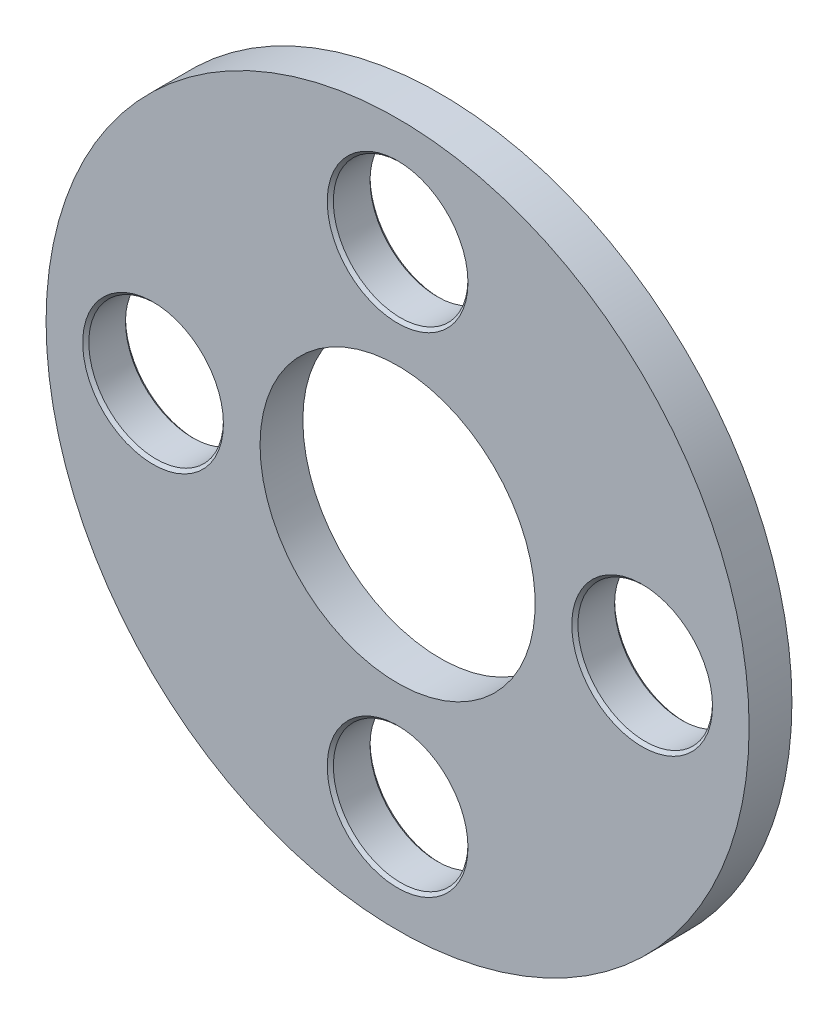
ISO-10303-21;
HEADER;
FILE_DESCRIPTION(('STEP AP214'),'2;1');
FILE_NAME('part.step','',(''),(''),'','','');
FILE_SCHEMA(('AUTOMOTIVE_DESIGN { 1 0 10303 214 1 1 1 1 }'));
ENDSEC;
DATA;
#1=APPLICATION_CONTEXT('core data for automotive mechanical design processes');
#2=APPLICATION_PROTOCOL_DEFINITION('international standard','automotive_design',2000,#1);
#3=PRODUCT_CONTEXT('',#1,'mechanical');
#4=PRODUCT('Part','Part','',(#3));
#5=PRODUCT_RELATED_PRODUCT_CATEGORY('part','',(#4));
#6=PRODUCT_DEFINITION_FORMATION('','',#4);
#7=PRODUCT_DEFINITION_CONTEXT('part definition',#1,'design');
#8=PRODUCT_DEFINITION('design','',#6,#7);
#9=PRODUCT_DEFINITION_SHAPE('','',#8);
#10=(LENGTH_UNIT() NAMED_UNIT(*) SI_UNIT(.MILLI.,.METRE.));
#11=(NAMED_UNIT(*) PLANE_ANGLE_UNIT() SI_UNIT($,.RADIAN.));
#12=(NAMED_UNIT(*) SI_UNIT($,.STERADIAN.) SOLID_ANGLE_UNIT());
#13=UNCERTAINTY_MEASURE_WITH_UNIT(LENGTH_MEASURE(1.E-05),#10,'distance_accuracy_value','');
#14=(GEOMETRIC_REPRESENTATION_CONTEXT(3) GLOBAL_UNCERTAINTY_ASSIGNED_CONTEXT((#13)) GLOBAL_UNIT_ASSIGNED_CONTEXT((#10,
#11,#12)) REPRESENTATION_CONTEXT('',''));
#15=CARTESIAN_POINT('',(0.,0.,0.));
#16=DIRECTION('',(0.,0.,1.));
#17=DIRECTION('',(1.,0.,0.));
#18=AXIS2_PLACEMENT_3D('',#15,#16,#17);
#19=CARTESIAN_POINT('',(0.,0.,-7.));
#20=DIRECTION('',(0.,0.,-1.));
#21=DIRECTION('',(-1.,0.,0.));
#22=AXIS2_PLACEMENT_3D('',#19,#20,#21);
#23=PLANE('',#22);
#24=CARTESIAN_POINT('',(-4.18977760661176E-13,-40.,-7.));
#25=DIRECTION('',(0.,0.,-1.));
#26=DIRECTION('',(-1.,0.,0.));
#27=AXIS2_PLACEMENT_3D('',#24,#25,#26);
#28=CIRCLE('',#27,11.51);
#29=CARTESIAN_POINT('',(-11.5100000000004,-40.,-7.));
#30=VERTEX_POINT('',#29);
#31=EDGE_CURVE('E49',#30,#30,#28,.F.);
#32=ORIENTED_EDGE('',*,*,#31,.T.);
#33=EDGE_LOOP('',(#32));
#34=FACE_BOUND('',#33,.T.);
#35=CARTESIAN_POINT('',(40.,0.,-7.));
#36=DIRECTION('',(0.,0.,-1.));
#37=DIRECTION('',(-1.,0.,0.));
#38=AXIS2_PLACEMENT_3D('',#35,#36,#37);
#39=CIRCLE('',#38,11.51);
#40=CARTESIAN_POINT('',(28.49,0.,-7.));
#41=VERTEX_POINT('',#40);
#42=EDGE_CURVE('E63',#41,#41,#39,.F.);
#43=ORIENTED_EDGE('',*,*,#42,.T.);
#44=EDGE_LOOP('',(#43));
#45=FACE_BOUND('',#44,.T.);
#46=CARTESIAN_POINT('',(1.39659253553725E-13,40.,-7.));
#47=DIRECTION('',(0.,0.,-1.));
#48=DIRECTION('',(-1.,0.,0.));
#49=AXIS2_PLACEMENT_3D('',#46,#47,#48);
#50=CIRCLE('',#49,11.51);
#51=CARTESIAN_POINT('',(-11.5099999999999,40.,-7.));
#52=VERTEX_POINT('',#51);
#53=EDGE_CURVE('E75',#52,#52,#50,.F.);
#54=ORIENTED_EDGE('',*,*,#53,.T.);
#55=EDGE_LOOP('',(#54));
#56=FACE_BOUND('',#55,.T.);
#57=CARTESIAN_POINT('',(-40.,0.,-7.));
#58=DIRECTION('',(0.,0.,-1.));
#59=DIRECTION('',(-1.,0.,0.));
#60=AXIS2_PLACEMENT_3D('',#57,#58,#59);
#61=CIRCLE('',#60,11.51);
#62=CARTESIAN_POINT('',(-51.51,0.,-7.));
#63=VERTEX_POINT('',#62);
#64=EDGE_CURVE('E87',#63,#63,#61,.F.);
#65=ORIENTED_EDGE('',*,*,#64,.T.);
#66=EDGE_LOOP('',(#65));
#67=FACE_BOUND('',#66,.T.);
#68=CARTESIAN_POINT('',(0.,0.,-7.));
#69=DIRECTION('',(0.,0.,-1.));
#70=DIRECTION('',(-1.,0.,0.));
#71=AXIS2_PLACEMENT_3D('',#68,#69,#70);
#72=CIRCLE('',#71,57.5);
#73=CARTESIAN_POINT('',(-57.5,0.,-7.));
#74=VERTEX_POINT('',#73);
#75=EDGE_CURVE('E90',#74,#74,#72,.T.);
#76=ORIENTED_EDGE('',*,*,#75,.T.);
#77=EDGE_LOOP('',(#76));
#78=FACE_BOUND('',#77,.T.);
#79=CARTESIAN_POINT('',(0.,0.,-7.));
#80=DIRECTION('',(0.,0.,-1.));
#81=DIRECTION('',(-1.,0.,0.));
#82=AXIS2_PLACEMENT_3D('',#79,#80,#81);
#83=CIRCLE('',#82,22.5);
#84=CARTESIAN_POINT('',(-22.5,0.,-7.));
#85=VERTEX_POINT('',#84);
#86=EDGE_CURVE('E94',#85,#85,#83,.T.);
#87=ORIENTED_EDGE('',*,*,#86,.F.);
#88=EDGE_LOOP('',(#87));
#89=FACE_BOUND('',#88,.T.);
#90=ADVANCED_FACE('F33',(#34,#45,#56,#67,#78,#89),#23,.T.);
#91=CARTESIAN_POINT('',(0.,0.,0.));
#92=DIRECTION('',(0.,0.,-1.));
#93=DIRECTION('',(-1.,0.,0.));
#94=AXIS2_PLACEMENT_3D('',#91,#92,#93);
#95=PLANE('',#94);
#96=CARTESIAN_POINT('',(-4.18977760661176E-13,-40.,0.));
#97=DIRECTION('',(0.,0.,-1.));
#98=DIRECTION('',(-1.,0.,0.));
#99=AXIS2_PLACEMENT_3D('',#96,#97,#98);
#100=CIRCLE('',#99,11.51);
#101=CARTESIAN_POINT('',(11.5099999999996,-40.,0.));
#102=VERTEX_POINT('',#101);
#103=EDGE_CURVE('E10',#102,#102,#100,.T.);
#104=ORIENTED_EDGE('',*,*,#103,.T.);
#105=EDGE_LOOP('',(#104));
#106=FACE_BOUND('',#105,.T.);
#107=CARTESIAN_POINT('',(40.,0.,0.));
#108=DIRECTION('',(0.,0.,-1.));
#109=DIRECTION('',(-1.,0.,0.));
#110=AXIS2_PLACEMENT_3D('',#107,#108,#109);
#111=CIRCLE('',#110,11.51);
#112=CARTESIAN_POINT('',(51.51,0.,0.));
#113=VERTEX_POINT('',#112);
#114=EDGE_CURVE('E54',#113,#113,#111,.T.);
#115=ORIENTED_EDGE('',*,*,#114,.T.);
#116=EDGE_LOOP('',(#115));
#117=FACE_BOUND('',#116,.T.);
#118=CARTESIAN_POINT('',(1.39659253553725E-13,40.,0.));
#119=DIRECTION('',(0.,0.,-1.));
#120=DIRECTION('',(-1.,0.,0.));
#121=AXIS2_PLACEMENT_3D('',#118,#119,#120);
#122=CIRCLE('',#121,11.51);
#123=CARTESIAN_POINT('',(11.5100000000001,40.,0.));
#124=VERTEX_POINT('',#123);
#125=EDGE_CURVE('E66',#124,#124,#122,.T.);
#126=ORIENTED_EDGE('',*,*,#125,.T.);
#127=EDGE_LOOP('',(#126));
#128=FACE_BOUND('',#127,.T.);
#129=CARTESIAN_POINT('',(-40.,0.,0.));
#130=DIRECTION('',(0.,0.,-1.));
#131=DIRECTION('',(-1.,0.,0.));
#132=AXIS2_PLACEMENT_3D('',#129,#130,#131);
#133=CIRCLE('',#132,11.51);
#134=CARTESIAN_POINT('',(-28.49,0.,0.));
#135=VERTEX_POINT('',#134);
#136=EDGE_CURVE('E78',#135,#135,#133,.T.);
#137=ORIENTED_EDGE('',*,*,#136,.T.);
#138=EDGE_LOOP('',(#137));
#139=FACE_BOUND('',#138,.T.);
#140=CARTESIAN_POINT('',(0.,0.,0.));
#141=DIRECTION('',(0.,0.,-1.));
#142=DIRECTION('',(-1.,0.,0.));
#143=AXIS2_PLACEMENT_3D('',#140,#141,#142);
#144=CIRCLE('',#143,57.5);
#145=CARTESIAN_POINT('',(-57.5,0.,0.));
#146=VERTEX_POINT('',#145);
#147=EDGE_CURVE('E91',#146,#146,#144,.T.);
#148=ORIENTED_EDGE('',*,*,#147,.F.);
#149=EDGE_LOOP('',(#148));
#150=FACE_BOUND('',#149,.T.);
#151=CARTESIAN_POINT('',(0.,0.,0.));
#152=DIRECTION('',(0.,0.,-1.));
#153=DIRECTION('',(-1.,0.,0.));
#154=AXIS2_PLACEMENT_3D('',#151,#152,#153);
#155=CIRCLE('',#154,22.5);
#156=CARTESIAN_POINT('',(-22.5,0.,0.));
#157=VERTEX_POINT('',#156);
#158=EDGE_CURVE('E97',#157,#157,#155,.T.);
#159=ORIENTED_EDGE('',*,*,#158,.T.);
#160=EDGE_LOOP('',(#159));
#161=FACE_BOUND('',#160,.T.);
#162=ADVANCED_FACE('F107',(#106,#117,#128,#139,#150,#161),#95,.F.);
#163=CARTESIAN_POINT('',(0.,0.,-7.));
#164=DIRECTION('',(0.,0.,1.));
#165=DIRECTION('',(1.,0.,0.));
#166=AXIS2_PLACEMENT_3D('',#163,#164,#165);
#167=CYLINDRICAL_SURFACE('',#166,57.5);
#168=ORIENTED_EDGE('',*,*,#75,.F.);
#169=EDGE_LOOP('',(#168));
#170=FACE_BOUND('',#169,.T.);
#171=ORIENTED_EDGE('',*,*,#147,.T.);
#172=EDGE_LOOP('',(#171));
#173=FACE_BOUND('',#172,.T.);
#174=ADVANCED_FACE('F113',(#170,#173),#167,.T.);
#175=CARTESIAN_POINT('',(0.,0.,-7.));
#176=DIRECTION('',(0.,0.,1.));
#177=DIRECTION('',(1.,0.,0.));
#178=AXIS2_PLACEMENT_3D('',#175,#176,#177);
#179=CYLINDRICAL_SURFACE('',#178,22.5);
#180=ORIENTED_EDGE('',*,*,#86,.T.);
#181=EDGE_LOOP('',(#180));
#182=FACE_BOUND('',#181,.T.);
#183=ORIENTED_EDGE('',*,*,#158,.F.);
#184=EDGE_LOOP('',(#183));
#185=FACE_BOUND('',#184,.T.);
#186=ADVANCED_FACE('F103',(#182,#185),#179,.F.);
#187=CARTESIAN_POINT('',(-40.,0.,-7.));
#188=DIRECTION('',(0.,0.,1.));
#189=DIRECTION('',(1.,0.,0.));
#190=AXIS2_PLACEMENT_3D('',#187,#188,#189);
#191=CYLINDRICAL_SURFACE('',#190,11.01);
#192=CARTESIAN_POINT('',(-40.,0.,-6.50000000000001));
#193=DIRECTION('',(0.,0.,-1.));
#194=DIRECTION('',(-1.,0.,0.));
#195=AXIS2_PLACEMENT_3D('',#192,#193,#194);
#196=CIRCLE('',#195,11.01);
#197=CARTESIAN_POINT('',(-51.01,0.,-6.50000000000001));
#198=VERTEX_POINT('',#197);
#199=EDGE_CURVE('E81',#198,#198,#196,.T.);
#200=ORIENTED_EDGE('',*,*,#199,.T.);
#201=EDGE_LOOP('',(#200));
#202=FACE_BOUND('',#201,.T.);
#203=CARTESIAN_POINT('',(-40.,0.,-0.50000000000002));
#204=DIRECTION('',(0.,0.,-1.));
#205=DIRECTION('',(-1.,0.,0.));
#206=AXIS2_PLACEMENT_3D('',#203,#204,#205);
#207=CIRCLE('',#206,11.01);
#208=CARTESIAN_POINT('',(-28.99,0.,-0.500000000000019));
#209=VERTEX_POINT('',#208);
#210=EDGE_CURVE('E84',#209,#209,#207,.F.);
#211=ORIENTED_EDGE('',*,*,#210,.T.);
#212=EDGE_LOOP('',(#211));
#213=FACE_BOUND('',#212,.T.);
#214=ADVANCED_FACE('F130',(#202,#213),#191,.F.);
#215=CARTESIAN_POINT('',(-40.,0.,-7.));
#216=DIRECTION('',(0.,0.,-1.));
#217=DIRECTION('',(-1.,0.,0.));
#218=AXIS2_PLACEMENT_3D('',#215,#216,#217);
#219=CONICAL_SURFACE('',#218,11.51,0.785398163397467);
#220=ORIENTED_EDGE('',*,*,#199,.F.);
#221=EDGE_LOOP('',(#220));
#222=FACE_BOUND('',#221,.T.);
#223=ORIENTED_EDGE('',*,*,#64,.F.);
#224=EDGE_LOOP('',(#223));
#225=FACE_BOUND('',#224,.T.);
#226=ADVANCED_FACE('F123',(#222,#225),#219,.F.);
#227=CARTESIAN_POINT('',(-40.,0.,-0.50000000000002));
#228=DIRECTION('',(0.,0.,1.));
#229=DIRECTION('',(1.,0.,0.));
#230=AXIS2_PLACEMENT_3D('',#227,#228,#229);
#231=CONICAL_SURFACE('',#230,11.01,0.785398163397436);
#232=CARTESIAN_POINT('',(-28.49,0.,0.));
#233=CARTESIAN_POINT('',(-28.4952083333333,0.,-0.00520833333333384));
#234=CARTESIAN_POINT('',(-28.5004166666667,0.,-0.0104166666666673));
#235=CARTESIAN_POINT('',(-28.5108333333333,0.,-0.0208333333333342));
#236=CARTESIAN_POINT('',(-28.5160416666667,0.,-0.0260416666666677));
#237=CARTESIAN_POINT('',(-28.5264583333333,0.,-0.0364583333333344));
#238=CARTESIAN_POINT('',(-28.5316666666667,0.,-0.0416666666666678));
#239=CARTESIAN_POINT('',(-28.5420833333333,0.,-0.052083333333335));
#240=CARTESIAN_POINT('',(-28.5472916666667,0.,-0.0572916666666689));
#241=CARTESIAN_POINT('',(-28.5577083333333,0.,-0.0677083333333362));
#242=CARTESIAN_POINT('',(-28.5629166666667,0.,-0.0729166666666695));
#243=CARTESIAN_POINT('',(-28.5733333333333,0.,-0.0833333333333363));
#244=CARTESIAN_POINT('',(-28.5785416666667,0.,-0.0885416666666697));
#245=CARTESIAN_POINT('',(-28.5889583333333,0.,-0.0989583333333368));
#246=CARTESIAN_POINT('',(-28.5941666666667,0.,-0.10416666666667));
#247=CARTESIAN_POINT('',(-28.6045833333333,0.,-0.114583333333338));
#248=CARTESIAN_POINT('',(-28.6097916666667,0.,-0.119791666666671));
#249=CARTESIAN_POINT('',(-28.6202083333333,0.,-0.130208333333339));
#250=CARTESIAN_POINT('',(-28.6254166666667,0.,-0.135416666666672));
#251=CARTESIAN_POINT('',(-28.6358333333333,0.,-0.145833333333339));
#252=CARTESIAN_POINT('',(-28.6410416666667,0.,-0.151041666666672));
#253=CARTESIAN_POINT('',(-28.6514583333333,0.,-0.161458333333339));
#254=CARTESIAN_POINT('',(-28.6566666666667,0.,-0.166666666666673));
#255=CARTESIAN_POINT('',(-28.6670833333333,0.,-0.17708333333334));
#256=CARTESIAN_POINT('',(-28.6722916666667,0.,-0.182291666666674));
#257=CARTESIAN_POINT('',(-28.6827083333333,0.,-0.192708333333341));
#258=CARTESIAN_POINT('',(-28.6879166666667,0.,-0.197916666666674));
#259=CARTESIAN_POINT('',(-28.6983333333333,0.,-0.208333333333341));
#260=CARTESIAN_POINT('',(-28.7035416666667,0.,-0.213541666666675));
#261=CARTESIAN_POINT('',(-28.7139583333333,0.,-0.223958333333342));
#262=CARTESIAN_POINT('',(-28.7191666666667,0.,-0.229166666666676));
#263=CARTESIAN_POINT('',(-28.7295833333333,0.,-0.239583333333343));
#264=CARTESIAN_POINT('',(-28.7347916666667,0.,-0.244791666666676));
#265=CARTESIAN_POINT('',(-28.7452083333333,0.,-0.255208333333343));
#266=CARTESIAN_POINT('',(-28.7504166666667,0.,-0.260416666666676));
#267=CARTESIAN_POINT('',(-28.7608333333333,0.,-0.270833333333343));
#268=CARTESIAN_POINT('',(-28.7660416666667,0.,-0.276041666666677));
#269=CARTESIAN_POINT('',(-28.7764583333333,0.,-0.286458333333345));
#270=CARTESIAN_POINT('',(-28.7816666666667,0.,-0.291666666666678));
#271=CARTESIAN_POINT('',(-28.7920833333333,0.,-0.302083333333345));
#272=CARTESIAN_POINT('',(-28.7972916666667,0.,-0.307291666666679));
#273=CARTESIAN_POINT('',(-28.8077083333333,0.,-0.317708333333345));
#274=CARTESIAN_POINT('',(-28.8129166666667,0.,-0.322916666666679));
#275=CARTESIAN_POINT('',(-28.8233333333333,0.,-0.333333333333346));
#276=CARTESIAN_POINT('',(-28.8285416666667,0.,-0.33854166666668));
#277=CARTESIAN_POINT('',(-28.8389583333333,0.,-0.348958333333347));
#278=CARTESIAN_POINT('',(-28.8441666666667,0.,-0.354166666666681));
#279=CARTESIAN_POINT('',(-28.8545833333333,0.,-0.364583333333347));
#280=CARTESIAN_POINT('',(-28.8597916666667,0.,-0.369791666666681));
#281=CARTESIAN_POINT('',(-28.8702083333333,0.,-0.380208333333348));
#282=CARTESIAN_POINT('',(-28.8754166666667,0.,-0.385416666666681));
#283=CARTESIAN_POINT('',(-28.8858333333333,0.,-0.395833333333349));
#284=CARTESIAN_POINT('',(-28.8910416666667,0.,-0.401041666666683));
#285=CARTESIAN_POINT('',(-28.9014583333333,0.,-0.41145833333335));
#286=CARTESIAN_POINT('',(-28.9066666666667,0.,-0.416666666666683));
#287=CARTESIAN_POINT('',(-28.9170833333333,0.,-0.42708333333335));
#288=CARTESIAN_POINT('',(-28.9222916666667,0.,-0.432291666666683));
#289=CARTESIAN_POINT('',(-28.9327083333333,0.,-0.44270833333335));
#290=CARTESIAN_POINT('',(-28.9379166666667,0.,-0.447916666666684));
#291=CARTESIAN_POINT('',(-28.9483333333333,0.,-0.458333333333351));
#292=CARTESIAN_POINT('',(-28.9535416666667,0.,-0.463541666666685));
#293=CARTESIAN_POINT('',(-28.9639583333333,0.,-0.473958333333352));
#294=CARTESIAN_POINT('',(-28.9691666666667,0.,-0.479166666666685));
#295=CARTESIAN_POINT('',(-28.9795833333333,0.,-0.489583333333352));
#296=CARTESIAN_POINT('',(-28.9847916666667,0.,-0.494791666666685));
#297=CARTESIAN_POINT('',(-28.99,0.,-0.500000000000019));
#298=B_SPLINE_CURVE_WITH_KNOTS('',3,(#232,#233,#234,#235,#236,#237,#238,#239,#240,#241,#242,
#243,#244,#245,#246,#247,#248,#249,#250,#251,#252,#253,#254,#255,#256,#257,#258,#259,#260,#261,
#262,#263,#264,#265,#266,#267,#268,#269,#270,#271,#272,#273,#274,#275,#276,#277,#278,#279,#280,
#281,#282,#283,#284,#285,#286,#287,#288,#289,#290,#291,#292,#293,#294,#295,#296,#297),
.UNSPECIFIED.,.F.,.F.,(4,2,2,2,2,2,2,2,2,2,2,2,2,2,2,2,2,2,2,2,2,2,2,2,2,2,2,2,2,2,2,2,4),(0.,
0.0220970869120788,0.0441941738241601,0.0662912607362414,0.0883883476483202,0.110485434560401,
0.132582521472483,0.154679608384562,0.17677669529664,0.198873782208722,0.220970869120803,
0.243067956032882,0.265165042944961,0.287262129857044,0.309359216769123,0.331456303681202,
0.353553390593283,0.375650477505365,0.397747564417443,0.419844651329522,0.441941738241603,
0.464038825153685,0.486135912065764,0.508232998977845,0.530330085889926,0.552427172802005,
0.574524259714084,0.596621346626165,0.618718433538246,0.640815520450325,0.662912607362407,
0.685009694274488,0.707106781186567),.UNSPECIFIED.);
#299=EDGE_CURVE('BSEAM129',#135,#209,#298,.T.);
#300=ORIENTED_EDGE('',*,*,#136,.F.);
#301=ORIENTED_EDGE('',*,*,#210,.F.);
#302=ORIENTED_EDGE('',*,*,#299,.T.);
#303=ORIENTED_EDGE('',*,*,#299,.F.);
#304=EDGE_LOOP('',(#300,#302,#301,#303));
#305=FACE_BOUND('',#304,.T.);
#306=ADVANCED_FACE('F129',(#305),#231,.F.);
#307=CARTESIAN_POINT('',(-4.18977760661176E-13,-40.,-7.));
#308=DIRECTION('',(0.,0.,1.));
#309=DIRECTION('',(1.,0.,0.));
#310=AXIS2_PLACEMENT_3D('',#307,#308,#309);
#311=CYLINDRICAL_SURFACE('',#310,11.01);
#312=CARTESIAN_POINT('',(-4.18977760661176E-13,-40.,-6.50000000000001));
#313=DIRECTION('',(0.,0.,-1.));
#314=DIRECTION('',(-1.,0.,0.));
#315=AXIS2_PLACEMENT_3D('',#312,#313,#314);
#316=CIRCLE('',#315,11.01);
#317=CARTESIAN_POINT('',(-11.0100000000004,-40.,-6.50000000000001));
#318=VERTEX_POINT('',#317);
#319=EDGE_CURVE('E41',#318,#318,#316,.T.);
#320=ORIENTED_EDGE('',*,*,#319,.T.);
#321=EDGE_LOOP('',(#320));
#322=FACE_BOUND('',#321,.T.);
#323=CARTESIAN_POINT('',(-4.18977760661176E-13,-40.,-0.50000000000002));
#324=DIRECTION('',(0.,0.,-1.));
#325=DIRECTION('',(-1.,0.,0.));
#326=AXIS2_PLACEMENT_3D('',#323,#324,#325);
#327=CIRCLE('',#326,11.01);
#328=CARTESIAN_POINT('',(11.0099999999996,-40.,-0.500000000000019));
#329=VERTEX_POINT('',#328);
#330=EDGE_CURVE('E45',#329,#329,#327,.F.);
#331=ORIENTED_EDGE('',*,*,#330,.T.);
#332=EDGE_LOOP('',(#331));
#333=FACE_BOUND('',#332,.T.);
#334=ADVANCED_FACE('F137',(#322,#333),#311,.F.);
#335=CARTESIAN_POINT('',(40.,0.,-7.));
#336=DIRECTION('',(0.,0.,1.));
#337=DIRECTION('',(1.,0.,0.));
#338=AXIS2_PLACEMENT_3D('',#335,#336,#337);
#339=CYLINDRICAL_SURFACE('',#338,11.01);
#340=CARTESIAN_POINT('',(40.,0.,-6.50000000000001));
#341=DIRECTION('',(0.,0.,-1.));
#342=DIRECTION('',(-1.,0.,0.));
#343=AXIS2_PLACEMENT_3D('',#340,#341,#342);
#344=CIRCLE('',#343,11.01);
#345=CARTESIAN_POINT('',(28.99,0.,-6.50000000000001));
#346=VERTEX_POINT('',#345);
#347=EDGE_CURVE('E57',#346,#346,#344,.T.);
#348=ORIENTED_EDGE('',*,*,#347,.T.);
#349=EDGE_LOOP('',(#348));
#350=FACE_BOUND('',#349,.T.);
#351=CARTESIAN_POINT('',(40.,0.,-0.50000000000002));
#352=DIRECTION('',(0.,0.,-1.));
#353=DIRECTION('',(-1.,0.,0.));
#354=AXIS2_PLACEMENT_3D('',#351,#352,#353);
#355=CIRCLE('',#354,11.01);
#356=CARTESIAN_POINT('',(51.01,0.,-0.500000000000019));
#357=VERTEX_POINT('',#356);
#358=EDGE_CURVE('E60',#357,#357,#355,.F.);
#359=ORIENTED_EDGE('',*,*,#358,.T.);
#360=EDGE_LOOP('',(#359));
#361=FACE_BOUND('',#360,.T.);
#362=ADVANCED_FACE('F184',(#350,#361),#339,.F.);
#363=CARTESIAN_POINT('',(1.39659253553725E-13,40.,-7.));
#364=DIRECTION('',(0.,0.,1.));
#365=DIRECTION('',(1.,0.,0.));
#366=AXIS2_PLACEMENT_3D('',#363,#364,#365);
#367=CYLINDRICAL_SURFACE('',#366,11.01);
#368=CARTESIAN_POINT('',(1.39659253553725E-13,40.,-6.50000000000001));
#369=DIRECTION('',(0.,0.,-1.));
#370=DIRECTION('',(-1.,0.,0.));
#371=AXIS2_PLACEMENT_3D('',#368,#369,#370);
#372=CIRCLE('',#371,11.01);
#373=CARTESIAN_POINT('',(-11.0099999999999,40.,-6.50000000000001));
#374=VERTEX_POINT('',#373);
#375=EDGE_CURVE('E69',#374,#374,#372,.T.);
#376=ORIENTED_EDGE('',*,*,#375,.T.);
#377=EDGE_LOOP('',(#376));
#378=FACE_BOUND('',#377,.T.);
#379=CARTESIAN_POINT('',(1.39659253553725E-13,40.,-0.50000000000002));
#380=DIRECTION('',(0.,0.,-1.));
#381=DIRECTION('',(-1.,0.,0.));
#382=AXIS2_PLACEMENT_3D('',#379,#380,#381);
#383=CIRCLE('',#382,11.01);
#384=CARTESIAN_POINT('',(11.0100000000001,40.,-0.500000000000019));
#385=VERTEX_POINT('',#384);
#386=EDGE_CURVE('E72',#385,#385,#383,.F.);
#387=ORIENTED_EDGE('',*,*,#386,.T.);
#388=EDGE_LOOP('',(#387));
#389=FACE_BOUND('',#388,.T.);
#390=ADVANCED_FACE('F146',(#378,#389),#367,.F.);
#391=CARTESIAN_POINT('',(1.39659253553725E-13,40.,-7.));
#392=DIRECTION('',(0.,0.,-1.));
#393=DIRECTION('',(-1.,0.,0.));
#394=AXIS2_PLACEMENT_3D('',#391,#392,#393);
#395=CONICAL_SURFACE('',#394,11.51,0.785398163397467);
#396=ORIENTED_EDGE('',*,*,#375,.F.);
#397=EDGE_LOOP('',(#396));
#398=FACE_BOUND('',#397,.T.);
#399=ORIENTED_EDGE('',*,*,#53,.F.);
#400=EDGE_LOOP('',(#399));
#401=FACE_BOUND('',#400,.T.);
#402=ADVANCED_FACE('F139',(#398,#401),#395,.F.);
#403=CARTESIAN_POINT('',(1.39659253553725E-13,40.,-0.50000000000002));
#404=DIRECTION('',(0.,0.,1.));
#405=DIRECTION('',(1.,0.,0.));
#406=AXIS2_PLACEMENT_3D('',#403,#404,#405);
#407=CONICAL_SURFACE('',#406,11.01,0.785398163397436);
#408=CARTESIAN_POINT('',(11.5100000000001,40.,0.));
#409=CARTESIAN_POINT('',(11.5047916666668,40.,-0.00520833333333339));
#410=CARTESIAN_POINT('',(11.4995833333335,40.,-0.0104166666666669));
#411=CARTESIAN_POINT('',(11.4891666666668,40.,-0.020833333333334));
#412=CARTESIAN_POINT('',(11.4839583333335,40.,-0.0260416666666675));
#413=CARTESIAN_POINT('',(11.4735416666668,40.,-0.0364583333333346));
#414=CARTESIAN_POINT('',(11.4683333333335,40.,-0.0416666666666681));
#415=CARTESIAN_POINT('',(11.4579166666668,40.,-0.0520833333333353));
#416=CARTESIAN_POINT('',(11.4527083333335,40.,-0.0572916666666689));
#417=CARTESIAN_POINT('',(11.4422916666668,40.,-0.0677083333333359));
#418=CARTESIAN_POINT('',(11.4370833333335,40.,-0.0729166666666693));
#419=CARTESIAN_POINT('',(11.4266666666668,40.,-0.0833333333333362));
#420=CARTESIAN_POINT('',(11.4214583333335,40.,-0.0885416666666699));
#421=CARTESIAN_POINT('',(11.4110416666668,40.,-0.0989583333333371));
#422=CARTESIAN_POINT('',(11.4058333333335,40.,-0.104166666666671));
#423=CARTESIAN_POINT('',(11.3954166666668,40.,-0.114583333333338));
#424=CARTESIAN_POINT('',(11.3902083333335,40.,-0.119791666666671));
#425=CARTESIAN_POINT('',(11.3797916666668,40.,-0.130208333333338));
#426=CARTESIAN_POINT('',(11.3745833333335,40.,-0.135416666666672));
#427=CARTESIAN_POINT('',(11.3641666666668,40.,-0.145833333333339));
#428=CARTESIAN_POINT('',(11.3589583333335,40.,-0.151041666666672));
#429=CARTESIAN_POINT('',(11.3485416666668,40.,-0.161458333333339));
#430=CARTESIAN_POINT('',(11.3433333333335,40.,-0.166666666666673));
#431=CARTESIAN_POINT('',(11.3329166666668,40.,-0.17708333333334));
#432=CARTESIAN_POINT('',(11.3277083333335,40.,-0.182291666666674));
#433=CARTESIAN_POINT('',(11.3172916666668,40.,-0.192708333333341));
#434=CARTESIAN_POINT('',(11.3120833333335,40.,-0.197916666666674));
#435=CARTESIAN_POINT('',(11.3016666666668,40.,-0.208333333333341));
#436=CARTESIAN_POINT('',(11.2964583333335,40.,-0.213541666666675));
#437=CARTESIAN_POINT('',(11.2860416666668,40.,-0.223958333333342));
#438=CARTESIAN_POINT('',(11.2808333333335,40.,-0.229166666666676));
#439=CARTESIAN_POINT('',(11.2704166666668,40.,-0.239583333333343));
#440=CARTESIAN_POINT('',(11.2652083333335,40.,-0.244791666666676));
#441=CARTESIAN_POINT('',(11.2547916666668,40.,-0.255208333333343));
#442=CARTESIAN_POINT('',(11.2495833333335,40.,-0.260416666666677));
#443=CARTESIAN_POINT('',(11.2391666666668,40.,-0.270833333333344));
#444=CARTESIAN_POINT('',(11.2339583333335,40.,-0.276041666666677));
#445=CARTESIAN_POINT('',(11.2235416666668,40.,-0.286458333333344));
#446=CARTESIAN_POINT('',(11.2183333333335,40.,-0.291666666666678));
#447=CARTESIAN_POINT('',(11.2079166666668,40.,-0.302083333333345));
#448=CARTESIAN_POINT('',(11.2027083333335,40.,-0.307291666666679));
#449=CARTESIAN_POINT('',(11.1922916666668,40.,-0.317708333333346));
#450=CARTESIAN_POINT('',(11.1870833333335,40.,-0.322916666666679));
#451=CARTESIAN_POINT('',(11.1766666666668,40.,-0.333333333333346));
#452=CARTESIAN_POINT('',(11.1714583333335,40.,-0.33854166666668));
#453=CARTESIAN_POINT('',(11.1610416666668,40.,-0.348958333333347));
#454=CARTESIAN_POINT('',(11.1558333333335,40.,-0.35416666666668));
#455=CARTESIAN_POINT('',(11.1454166666668,40.,-0.364583333333347));
#456=CARTESIAN_POINT('',(11.1402083333335,40.,-0.369791666666681));
#457=CARTESIAN_POINT('',(11.1297916666668,40.,-0.380208333333348));
#458=CARTESIAN_POINT('',(11.1245833333335,40.,-0.385416666666682));
#459=CARTESIAN_POINT('',(11.1141666666668,40.,-0.395833333333349));
#460=CARTESIAN_POINT('',(11.1089583333335,40.,-0.401041666666682));
#461=CARTESIAN_POINT('',(11.0985416666668,40.,-0.411458333333349));
#462=CARTESIAN_POINT('',(11.0933333333335,40.,-0.416666666666683));
#463=CARTESIAN_POINT('',(11.0829166666668,40.,-0.42708333333335));
#464=CARTESIAN_POINT('',(11.0777083333335,40.,-0.432291666666684));
#465=CARTESIAN_POINT('',(11.0672916666668,40.,-0.442708333333351));
#466=CARTESIAN_POINT('',(11.0620833333335,40.,-0.447916666666684));
#467=CARTESIAN_POINT('',(11.0516666666668,40.,-0.458333333333351));
#468=CARTESIAN_POINT('',(11.0464583333335,40.,-0.463541666666685));
#469=CARTESIAN_POINT('',(11.0360416666668,40.,-0.473958333333352));
#470=CARTESIAN_POINT('',(11.0308333333335,40.,-0.479166666666685));
#471=CARTESIAN_POINT('',(11.0204166666668,40.,-0.489583333333352));
#472=CARTESIAN_POINT('',(11.0152083333335,40.,-0.494791666666686));
#473=CARTESIAN_POINT('',(11.0100000000001,40.,-0.500000000000019));
#474=B_SPLINE_CURVE_WITH_KNOTS('',3,(#408,#409,#410,#411,#412,#413,#414,#415,#416,#417,#418,
#419,#420,#421,#422,#423,#424,#425,#426,#427,#428,#429,#430,#431,#432,#433,#434,#435,#436,#437,
#438,#439,#440,#441,#442,#443,#444,#445,#446,#447,#448,#449,#450,#451,#452,#453,#454,#455,#456,
#457,#458,#459,#460,#461,#462,#463,#464,#465,#466,#467,#468,#469,#470,#471,#472,#473),
.UNSPECIFIED.,.F.,.F.,(4,2,2,2,2,2,2,2,2,2,2,2,2,2,2,2,2,2,2,2,2,2,2,2,2,2,2,2,2,2,2,2,4),(0.,
0.02209708691208,0.0441941738241601,0.0662912607362401,0.0883883476483202,0.110485434560401,
0.132582521472482,0.154679608384562,0.176776695296642,0.198873782208722,0.220970869120802,
0.243067956032882,0.265165042944962,0.287262129857043,0.309359216769123,0.331456303681203,
0.353553390593283,0.375650477505363,0.397747564417444,0.419844651329524,0.441941738241604,
0.464038825153685,0.486135912065765,0.508232998977845,0.530330085889925,0.552427172802005,
0.574524259714085,0.596621346626165,0.618718433538245,0.640815520450327,0.662912607362407,
0.685009694274487,0.707106781186567),.UNSPECIFIED.);
#475=EDGE_CURVE('BSEAM145',#124,#385,#474,.T.);
#476=ORIENTED_EDGE('',*,*,#125,.F.);
#477=ORIENTED_EDGE('',*,*,#386,.F.);
#478=ORIENTED_EDGE('',*,*,#475,.T.);
#479=ORIENTED_EDGE('',*,*,#475,.F.);
#480=EDGE_LOOP('',(#476,#478,#477,#479));
#481=FACE_BOUND('',#480,.T.);
#482=ADVANCED_FACE('F145',(#481),#407,.F.);
#483=CARTESIAN_POINT('',(40.,0.,-7.));
#484=DIRECTION('',(0.,0.,-1.));
#485=DIRECTION('',(-1.,0.,0.));
#486=AXIS2_PLACEMENT_3D('',#483,#484,#485);
#487=CONICAL_SURFACE('',#486,11.51,0.785398163397467);
#488=ORIENTED_EDGE('',*,*,#347,.F.);
#489=EDGE_LOOP('',(#488));
#490=FACE_BOUND('',#489,.T.);
#491=ORIENTED_EDGE('',*,*,#42,.F.);
#492=EDGE_LOOP('',(#491));
#493=FACE_BOUND('',#492,.T.);
#494=ADVANCED_FACE('F153',(#490,#493),#487,.F.);
#495=CARTESIAN_POINT('',(40.,0.,-0.50000000000002));
#496=DIRECTION('',(0.,0.,1.));
#497=DIRECTION('',(1.,0.,0.));
#498=AXIS2_PLACEMENT_3D('',#495,#496,#497);
#499=CONICAL_SURFACE('',#498,11.01,0.785398163397436);
#500=CARTESIAN_POINT('',(51.51,0.,0.));
#501=CARTESIAN_POINT('',(51.5047916666667,0.,-0.00520833333333503));
#502=CARTESIAN_POINT('',(51.4995833333333,0.,-0.010416666666668));
#503=CARTESIAN_POINT('',(51.4891666666667,0.,-0.020833333333334));
#504=CARTESIAN_POINT('',(51.4839583333333,0.,-0.026041666666667));
#505=CARTESIAN_POINT('',(51.4735416666667,0.,-0.0364583333333339));
#506=CARTESIAN_POINT('',(51.4683333333333,0.,-0.0416666666666678));
#507=CARTESIAN_POINT('',(51.4579166666667,0.,-0.0520833333333356));
#508=CARTESIAN_POINT('',(51.4527083333333,0.,-0.0572916666666695));
#509=CARTESIAN_POINT('',(51.4422916666667,0.,-0.0677083333333362));
#510=CARTESIAN_POINT('',(51.4370833333333,0.,-0.0729166666666689));
#511=CARTESIAN_POINT('',(51.4266666666667,0.,-0.0833333333333357));
#512=CARTESIAN_POINT('',(51.4214583333333,0.,-0.0885416666666698));
#513=CARTESIAN_POINT('',(51.4110416666667,0.,-0.0989583333333373));
#514=CARTESIAN_POINT('',(51.4058333333333,0.,-0.104166666666671));
#515=CARTESIAN_POINT('',(51.3954166666667,0.,-0.114583333333338));
#516=CARTESIAN_POINT('',(51.3902083333333,0.,-0.119791666666671));
#517=CARTESIAN_POINT('',(51.3797916666667,0.,-0.130208333333338));
#518=CARTESIAN_POINT('',(51.3745833333333,0.,-0.135416666666673));
#519=CARTESIAN_POINT('',(51.3641666666667,0.,-0.145833333333339));
#520=CARTESIAN_POINT('',(51.3589583333333,0.,-0.151041666666672));
#521=CARTESIAN_POINT('',(51.3485416666667,0.,-0.161458333333339));
#522=CARTESIAN_POINT('',(51.3433333333333,0.,-0.166666666666673));
#523=CARTESIAN_POINT('',(51.3329166666667,0.,-0.177083333333341));
#524=CARTESIAN_POINT('',(51.3277083333333,0.,-0.182291666666674));
#525=CARTESIAN_POINT('',(51.3172916666667,0.,-0.192708333333341));
#526=CARTESIAN_POINT('',(51.3120833333333,0.,-0.197916666666674));
#527=CARTESIAN_POINT('',(51.3016666666667,0.,-0.208333333333341));
#528=CARTESIAN_POINT('',(51.2964583333333,0.,-0.213541666666675));
#529=CARTESIAN_POINT('',(51.2860416666667,0.,-0.223958333333342));
#530=CARTESIAN_POINT('',(51.2808333333333,0.,-0.229166666666676));
#531=CARTESIAN_POINT('',(51.2704166666667,0.,-0.239583333333343));
#532=CARTESIAN_POINT('',(51.2652083333333,0.,-0.244791666666676));
#533=CARTESIAN_POINT('',(51.2547916666667,0.,-0.255208333333342));
#534=CARTESIAN_POINT('',(51.2495833333333,0.,-0.260416666666676));
#535=CARTESIAN_POINT('',(51.2391666666667,0.,-0.270833333333344));
#536=CARTESIAN_POINT('',(51.2339583333333,0.,-0.276041666666677));
#537=CARTESIAN_POINT('',(51.2235416666667,0.,-0.286458333333344));
#538=CARTESIAN_POINT('',(51.2183333333333,0.,-0.291666666666678));
#539=CARTESIAN_POINT('',(51.2079166666667,0.,-0.302083333333345));
#540=CARTESIAN_POINT('',(51.2027083333333,0.,-0.307291666666679));
#541=CARTESIAN_POINT('',(51.1922916666667,0.,-0.317708333333346));
#542=CARTESIAN_POINT('',(51.1870833333333,0.,-0.322916666666679));
#543=CARTESIAN_POINT('',(51.1766666666667,0.,-0.333333333333345));
#544=CARTESIAN_POINT('',(51.1714583333333,0.,-0.338541666666679));
#545=CARTESIAN_POINT('',(51.1610416666667,0.,-0.348958333333347));
#546=CARTESIAN_POINT('',(51.1558333333333,0.,-0.354166666666681));
#547=CARTESIAN_POINT('',(51.1454166666667,0.,-0.364583333333348));
#548=CARTESIAN_POINT('',(51.1402083333333,0.,-0.369791666666681));
#549=CARTESIAN_POINT('',(51.1297916666667,0.,-0.380208333333347));
#550=CARTESIAN_POINT('',(51.1245833333333,0.,-0.385416666666681));
#551=CARTESIAN_POINT('',(51.1141666666667,0.,-0.395833333333349));
#552=CARTESIAN_POINT('',(51.1089583333333,0.,-0.401041666666683));
#553=CARTESIAN_POINT('',(51.0985416666667,0.,-0.41145833333335));
#554=CARTESIAN_POINT('',(51.0933333333333,0.,-0.416666666666682));
#555=CARTESIAN_POINT('',(51.0829166666667,0.,-0.427083333333349));
#556=CARTESIAN_POINT('',(51.0777083333333,0.,-0.432291666666683));
#557=CARTESIAN_POINT('',(51.0672916666667,0.,-0.442708333333351));
#558=CARTESIAN_POINT('',(51.0620833333333,0.,-0.447916666666685));
#559=CARTESIAN_POINT('',(51.0516666666667,0.,-0.458333333333351));
#560=CARTESIAN_POINT('',(51.0464583333333,0.,-0.463541666666684));
#561=CARTESIAN_POINT('',(51.0360416666667,0.,-0.473958333333351));
#562=CARTESIAN_POINT('',(51.0308333333333,0.,-0.479166666666685));
#563=CARTESIAN_POINT('',(51.0204166666667,0.,-0.489583333333353));
#564=CARTESIAN_POINT('',(51.0152083333333,0.,-0.494791666666687));
#565=CARTESIAN_POINT('',(51.01,0.,-0.500000000000019));
#566=B_SPLINE_CURVE_WITH_KNOTS('',3,(#500,#501,#502,#503,#504,#505,#506,#507,#508,#509,#510,
#511,#512,#513,#514,#515,#516,#517,#518,#519,#520,#521,#522,#523,#524,#525,#526,#527,#528,#529,
#530,#531,#532,#533,#534,#535,#536,#537,#538,#539,#540,#541,#542,#543,#544,#545,#546,#547,#548,
#549,#550,#551,#552,#553,#554,#555,#556,#557,#558,#559,#560,#561,#562,#563,#564,#565),
.UNSPECIFIED.,.F.,.F.,(4,2,2,2,2,2,2,2,2,2,2,2,2,2,2,2,2,2,2,2,2,2,2,2,2,2,2,2,2,2,2,2,4),(0.,
0.0220970869120788,0.0441941738241625,0.0662912607362414,0.0883883476483202,0.110485434560404,
0.132582521472483,0.154679608384562,0.17677669529664,0.198873782208719,0.220970869120803,
0.243067956032882,0.265165042944961,0.287262129857044,0.309359216769123,0.331456303681202,
0.353553390593286,0.375650477505364,0.397747564417443,0.419844651329522,0.441941738241601,
0.464038825153685,0.486135912065764,0.508232998977842,0.530330085889926,0.552427172802005,
0.574524259714084,0.596621346626168,0.618718433538246,0.640815520450325,0.662912607362409,
0.685009694274488,0.707106781186567),.UNSPECIFIED.);
#567=EDGE_CURVE('BSEAM160',#113,#357,#566,.T.);
#568=ORIENTED_EDGE('',*,*,#114,.F.);
#569=ORIENTED_EDGE('',*,*,#358,.F.);
#570=ORIENTED_EDGE('',*,*,#567,.T.);
#571=ORIENTED_EDGE('',*,*,#567,.F.);
#572=EDGE_LOOP('',(#568,#570,#569,#571));
#573=FACE_BOUND('',#572,.T.);
#574=ADVANCED_FACE('F160',(#573),#499,.F.);
#575=CARTESIAN_POINT('',(-4.18977760661176E-13,-40.,-7.));
#576=DIRECTION('',(0.,0.,-1.));
#577=DIRECTION('',(-1.,0.,0.));
#578=AXIS2_PLACEMENT_3D('',#575,#576,#577);
#579=CONICAL_SURFACE('',#578,11.51,0.785398163397467);
#580=ORIENTED_EDGE('',*,*,#319,.F.);
#581=EDGE_LOOP('',(#580));
#582=FACE_BOUND('',#581,.T.);
#583=ORIENTED_EDGE('',*,*,#31,.F.);
#584=EDGE_LOOP('',(#583));
#585=FACE_BOUND('',#584,.T.);
#586=ADVANCED_FACE('F166',(#582,#585),#579,.F.);
#587=CARTESIAN_POINT('',(-4.18977760661176E-13,-40.,-0.50000000000002));
#588=DIRECTION('',(0.,0.,1.));
#589=DIRECTION('',(1.,0.,0.));
#590=AXIS2_PLACEMENT_3D('',#587,#588,#589);
#591=CONICAL_SURFACE('',#590,11.01,0.785398163397436);
#592=CARTESIAN_POINT('',(11.5099999999996,-40.,0.));
#593=CARTESIAN_POINT('',(11.5047916666663,-40.,-0.00520833333333339));
#594=CARTESIAN_POINT('',(11.4995833333329,-40.,-0.0104166666666669));
#595=CARTESIAN_POINT('',(11.4891666666663,-40.,-0.020833333333334));
#596=CARTESIAN_POINT('',(11.4839583333329,-40.,-0.0260416666666675));
#597=CARTESIAN_POINT('',(11.4735416666663,-40.,-0.0364583333333346));
#598=CARTESIAN_POINT('',(11.4683333333329,-40.,-0.0416666666666681));
#599=CARTESIAN_POINT('',(11.4579166666663,-40.,-0.0520833333333353));
#600=CARTESIAN_POINT('',(11.4527083333329,-40.,-0.0572916666666689));
#601=CARTESIAN_POINT('',(11.4422916666663,-40.,-0.0677083333333359));
#602=CARTESIAN_POINT('',(11.4370833333329,-40.,-0.0729166666666693));
#603=CARTESIAN_POINT('',(11.4266666666663,-40.,-0.0833333333333362));
#604=CARTESIAN_POINT('',(11.4214583333329,-40.,-0.0885416666666699));
#605=CARTESIAN_POINT('',(11.4110416666663,-40.,-0.0989583333333371));
#606=CARTESIAN_POINT('',(11.4058333333329,-40.,-0.104166666666671));
#607=CARTESIAN_POINT('',(11.3954166666663,-40.,-0.114583333333338));
#608=CARTESIAN_POINT('',(11.3902083333329,-40.,-0.119791666666671));
#609=CARTESIAN_POINT('',(11.3797916666663,-40.,-0.130208333333338));
#610=CARTESIAN_POINT('',(11.3745833333329,-40.,-0.135416666666672));
#611=CARTESIAN_POINT('',(11.3641666666663,-40.,-0.145833333333339));
#612=CARTESIAN_POINT('',(11.3589583333329,-40.,-0.151041666666672));
#613=CARTESIAN_POINT('',(11.3485416666663,-40.,-0.161458333333339));
#614=CARTESIAN_POINT('',(11.3433333333329,-40.,-0.166666666666673));
#615=CARTESIAN_POINT('',(11.3329166666663,-40.,-0.17708333333334));
#616=CARTESIAN_POINT('',(11.3277083333329,-40.,-0.182291666666674));
#617=CARTESIAN_POINT('',(11.3172916666663,-40.,-0.192708333333341));
#618=CARTESIAN_POINT('',(11.3120833333329,-40.,-0.197916666666674));
#619=CARTESIAN_POINT('',(11.3016666666663,-40.,-0.208333333333341));
#620=CARTESIAN_POINT('',(11.2964583333329,-40.,-0.213541666666675));
#621=CARTESIAN_POINT('',(11.2860416666663,-40.,-0.223958333333342));
#622=CARTESIAN_POINT('',(11.2808333333329,-40.,-0.229166666666676));
#623=CARTESIAN_POINT('',(11.2704166666663,-40.,-0.239583333333343));
#624=CARTESIAN_POINT('',(11.2652083333329,-40.,-0.244791666666676));
#625=CARTESIAN_POINT('',(11.2547916666663,-40.,-0.255208333333343));
#626=CARTESIAN_POINT('',(11.2495833333329,-40.,-0.260416666666677));
#627=CARTESIAN_POINT('',(11.2391666666663,-40.,-0.270833333333344));
#628=CARTESIAN_POINT('',(11.2339583333329,-40.,-0.276041666666677));
#629=CARTESIAN_POINT('',(11.2235416666663,-40.,-0.286458333333344));
#630=CARTESIAN_POINT('',(11.2183333333329,-40.,-0.291666666666678));
#631=CARTESIAN_POINT('',(11.2079166666663,-40.,-0.302083333333345));
#632=CARTESIAN_POINT('',(11.2027083333329,-40.,-0.307291666666679));
#633=CARTESIAN_POINT('',(11.1922916666662,-40.,-0.317708333333346));
#634=CARTESIAN_POINT('',(11.1870833333329,-40.,-0.322916666666679));
#635=CARTESIAN_POINT('',(11.1766666666662,-40.,-0.333333333333346));
#636=CARTESIAN_POINT('',(11.1714583333329,-40.,-0.33854166666668));
#637=CARTESIAN_POINT('',(11.1610416666662,-40.,-0.348958333333347));
#638=CARTESIAN_POINT('',(11.1558333333329,-40.,-0.35416666666668));
#639=CARTESIAN_POINT('',(11.1454166666662,-40.,-0.364583333333347));
#640=CARTESIAN_POINT('',(11.1402083333329,-40.,-0.369791666666681));
#641=CARTESIAN_POINT('',(11.1297916666662,-40.,-0.380208333333348));
#642=CARTESIAN_POINT('',(11.1245833333329,-40.,-0.385416666666682));
#643=CARTESIAN_POINT('',(11.1141666666662,-40.,-0.395833333333349));
#644=CARTESIAN_POINT('',(11.1089583333329,-40.,-0.401041666666682));
#645=CARTESIAN_POINT('',(11.0985416666662,-40.,-0.411458333333349));
#646=CARTESIAN_POINT('',(11.0933333333329,-40.,-0.416666666666683));
#647=CARTESIAN_POINT('',(11.0829166666662,-40.,-0.42708333333335));
#648=CARTESIAN_POINT('',(11.0777083333329,-40.,-0.432291666666684));
#649=CARTESIAN_POINT('',(11.0672916666662,-40.,-0.442708333333351));
#650=CARTESIAN_POINT('',(11.0620833333329,-40.,-0.447916666666684));
#651=CARTESIAN_POINT('',(11.0516666666662,-40.,-0.458333333333351));
#652=CARTESIAN_POINT('',(11.0464583333329,-40.,-0.463541666666685));
#653=CARTESIAN_POINT('',(11.0360416666662,-40.,-0.473958333333352));
#654=CARTESIAN_POINT('',(11.0308333333329,-40.,-0.479166666666685));
#655=CARTESIAN_POINT('',(11.0204166666662,-40.,-0.489583333333352));
#656=CARTESIAN_POINT('',(11.0152083333329,-40.,-0.494791666666686));
#657=CARTESIAN_POINT('',(11.0099999999996,-40.,-0.500000000000019));
#658=B_SPLINE_CURVE_WITH_KNOTS('',3,(#592,#593,#594,#595,#596,#597,#598,#599,#600,#601,#602,
#603,#604,#605,#606,#607,#608,#609,#610,#611,#612,#613,#614,#615,#616,#617,#618,#619,#620,#621,
#622,#623,#624,#625,#626,#627,#628,#629,#630,#631,#632,#633,#634,#635,#636,#637,#638,#639,#640,
#641,#642,#643,#644,#645,#646,#647,#648,#649,#650,#651,#652,#653,#654,#655,#656,#657),
.UNSPECIFIED.,.F.,.F.,(4,2,2,2,2,2,2,2,2,2,2,2,2,2,2,2,2,2,2,2,2,2,2,2,2,2,2,2,2,2,2,2,4),(0.,
0.02209708691208,0.0441941738241601,0.0662912607362401,0.0883883476483202,0.110485434560401,
0.132582521472482,0.154679608384562,0.176776695296642,0.198873782208722,0.220970869120802,
0.243067956032882,0.265165042944962,0.287262129857043,0.309359216769123,0.331456303681203,
0.353553390593283,0.375650477505363,0.397747564417444,0.419844651329524,0.441941738241604,
0.464038825153685,0.486135912065765,0.508232998977845,0.530330085889925,0.552427172802005,
0.574524259714085,0.596621346626165,0.618718433538245,0.640815520450327,0.662912607362407,
0.685009694274487,0.707106781186567),.UNSPECIFIED.);
#659=EDGE_CURVE('BSEAM36',#102,#329,#658,.T.);
#660=ORIENTED_EDGE('',*,*,#103,.F.);
#661=ORIENTED_EDGE('',*,*,#330,.F.);
#662=ORIENTED_EDGE('',*,*,#659,.T.);
#663=ORIENTED_EDGE('',*,*,#659,.F.);
#664=EDGE_LOOP('',(#660,#662,#661,#663));
#665=FACE_BOUND('',#664,.T.);
#666=ADVANCED_FACE('F36',(#665),#591,.F.);
#667=CLOSED_SHELL('',(#90,#162,#174,#186,#214,#226,#306,#334,#362,#390,#402,#482,#494,#574,#586,#666));
#668=MANIFOLD_SOLID_BREP('B2',#667);
#669=ADVANCED_BREP_SHAPE_REPRESENTATION('',(#18,#668),#14);
#670=SHAPE_DEFINITION_REPRESENTATION(#9,#669);
ENDSEC;
END-ISO-10303-21;
